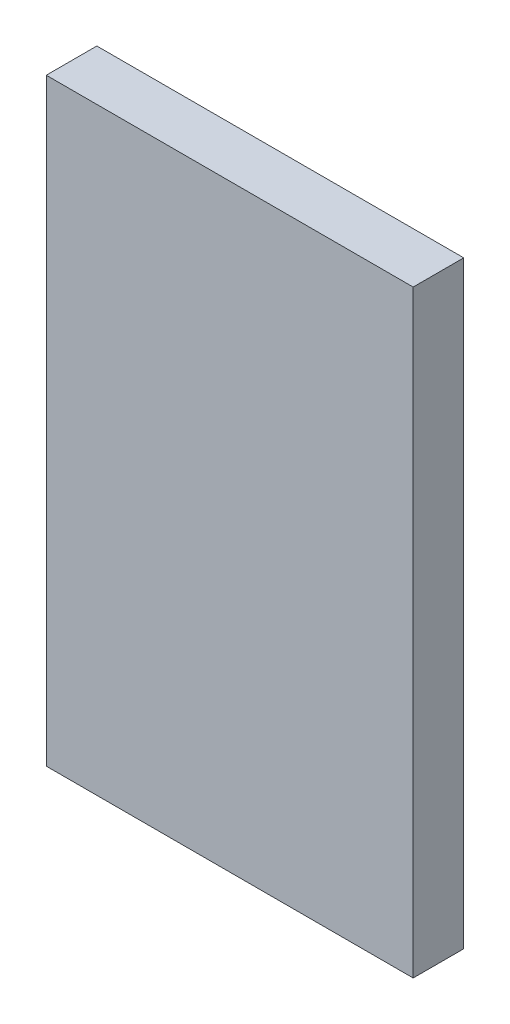
ISO-10303-21;
HEADER;
FILE_DESCRIPTION(('STEP AP214'),'2;1');
FILE_NAME('part.step','',(''),(''),'','','');
FILE_SCHEMA(('AUTOMOTIVE_DESIGN { 1 0 10303 214 1 1 1 1 }'));
ENDSEC;
DATA;
#1=APPLICATION_CONTEXT('core data for automotive mechanical design processes');
#2=APPLICATION_PROTOCOL_DEFINITION('international standard','automotive_design',2000,#1);
#3=PRODUCT_CONTEXT('',#1,'mechanical');
#4=PRODUCT('Part','Part','',(#3));
#5=PRODUCT_RELATED_PRODUCT_CATEGORY('part','',(#4));
#6=PRODUCT_DEFINITION_FORMATION('','',#4);
#7=PRODUCT_DEFINITION_CONTEXT('part definition',#1,'design');
#8=PRODUCT_DEFINITION('design','',#6,#7);
#9=PRODUCT_DEFINITION_SHAPE('','',#8);
#10=(LENGTH_UNIT() NAMED_UNIT(*) SI_UNIT(.MILLI.,.METRE.));
#11=(NAMED_UNIT(*) PLANE_ANGLE_UNIT() SI_UNIT($,.RADIAN.));
#12=(NAMED_UNIT(*) SI_UNIT($,.STERADIAN.) SOLID_ANGLE_UNIT());
#13=UNCERTAINTY_MEASURE_WITH_UNIT(LENGTH_MEASURE(1.E-05),#10,'distance_accuracy_value','');
#14=(GEOMETRIC_REPRESENTATION_CONTEXT(3) GLOBAL_UNCERTAINTY_ASSIGNED_CONTEXT((#13)) GLOBAL_UNIT_ASSIGNED_CONTEXT((#10,
#11,#12)) REPRESENTATION_CONTEXT('',''));
#15=CARTESIAN_POINT('',(0.,0.,0.));
#16=DIRECTION('',(0.,0.,1.));
#17=DIRECTION('',(1.,0.,0.));
#18=AXIS2_PLACEMENT_3D('',#15,#16,#17);
#19=CARTESIAN_POINT('',(-609.306060572635,400.501470811378,103.));
#20=DIRECTION('',(1.,0.,0.));
#21=DIRECTION('',(0.,1.,0.));
#22=AXIS2_PLACEMENT_3D('',#19,#20,#21);
#23=PLANE('',#22);
#24=DIRECTION('',(0.,-1.,0.));
#25=VECTOR('',#24,1.);
#26=CARTESIAN_POINT('',(-609.306060572635,400.501470811378,0.));
#27=LINE('',#26,#25);
#28=CARTESIAN_POINT('',(-609.306060572635,400.501470811378,0.));
#29=VERTEX_POINT('',#28);
#30=CARTESIAN_POINT('',(-609.306060572635,-818.118071672355,0.));
#31=VERTEX_POINT('',#30);
#32=EDGE_CURVE('E96',#29,#31,#27,.T.);
#33=ORIENTED_EDGE('',*,*,#32,.T.);
#34=DIRECTION('',(0.,0.,-1.));
#35=VECTOR('',#34,1.);
#36=CARTESIAN_POINT('',(-609.306060572635,-818.118071672355,103.));
#37=LINE('',#36,#35);
#38=CARTESIAN_POINT('',(-609.306060572635,-818.118071672355,103.));
#39=VERTEX_POINT('',#38);
#40=EDGE_CURVE('E11',#39,#31,#37,.T.);
#41=ORIENTED_EDGE('',*,*,#40,.F.);
#42=DIRECTION('',(0.,-1.,0.));
#43=VECTOR('',#42,1.);
#44=CARTESIAN_POINT('',(-609.306060572635,400.501470811378,103.));
#45=LINE('',#44,#43);
#46=CARTESIAN_POINT('',(-609.306060572635,400.501470811378,103.));
#47=VERTEX_POINT('',#46);
#48=EDGE_CURVE('E84',#47,#39,#45,.T.);
#49=ORIENTED_EDGE('',*,*,#48,.F.);
#50=DIRECTION('',(0.,0.,-1.));
#51=VECTOR('',#50,1.);
#52=CARTESIAN_POINT('',(-609.306060572635,400.501470811378,103.));
#53=LINE('',#52,#51);
#54=EDGE_CURVE('E92',#47,#29,#53,.T.);
#55=ORIENTED_EDGE('',*,*,#54,.T.);
#56=EDGE_LOOP('',(#33,#41,#49,#55));
#57=FACE_BOUND('',#56,.T.);
#58=ADVANCED_FACE('F33',(#57),#23,.F.);
#59=CARTESIAN_POINT('',(-609.306060572635,-818.118071672355,103.));
#60=DIRECTION('',(0.,1.,0.));
#61=DIRECTION('',(0.,0.,1.));
#62=AXIS2_PLACEMENT_3D('',#59,#60,#61);
#63=PLANE('',#62);
#64=DIRECTION('',(1.,0.,0.));
#65=VECTOR('',#64,1.);
#66=CARTESIAN_POINT('',(-609.306060572635,-818.118071672355,0.));
#67=LINE('',#66,#65);
#68=CARTESIAN_POINT('',(137.916258592071,-818.118071672355,0.));
#69=VERTEX_POINT('',#68);
#70=EDGE_CURVE('E88',#31,#69,#67,.T.);
#71=ORIENTED_EDGE('',*,*,#70,.T.);
#72=DIRECTION('',(0.,0.,-1.));
#73=VECTOR('',#72,1.);
#74=CARTESIAN_POINT('',(137.916258592071,-818.118071672355,103.));
#75=LINE('',#74,#73);
#76=CARTESIAN_POINT('',(137.916258592071,-818.118071672355,103.));
#77=VERTEX_POINT('',#76);
#78=EDGE_CURVE('E41',#77,#69,#75,.T.);
#79=ORIENTED_EDGE('',*,*,#78,.F.);
#80=DIRECTION('',(1.,0.,0.));
#81=VECTOR('',#80,1.);
#82=CARTESIAN_POINT('',(-609.306060572635,-818.118071672355,103.));
#83=LINE('',#82,#81);
#84=EDGE_CURVE('E79',#39,#77,#83,.T.);
#85=ORIENTED_EDGE('',*,*,#84,.F.);
#86=ORIENTED_EDGE('',*,*,#40,.T.);
#87=EDGE_LOOP('',(#71,#79,#85,#86));
#88=FACE_BOUND('',#87,.T.);
#89=ADVANCED_FACE('F87',(#88),#63,.F.);
#90=CARTESIAN_POINT('',(137.916258592071,400.501470811378,103.));
#91=DIRECTION('',(-1.,0.,0.));
#92=DIRECTION('',(0.,-1.,0.));
#93=AXIS2_PLACEMENT_3D('',#90,#91,#92);
#94=PLANE('',#93);
#95=DIRECTION('',(0.,1.,0.));
#96=VECTOR('',#95,1.);
#97=CARTESIAN_POINT('',(137.916258592071,400.501470811378,0.));
#98=LINE('',#97,#96);
#99=CARTESIAN_POINT('',(137.916258592071,400.501470811378,0.));
#100=VERTEX_POINT('',#99);
#101=EDGE_CURVE('E66',#69,#100,#98,.T.);
#102=ORIENTED_EDGE('',*,*,#101,.T.);
#103=DIRECTION('',(0.,0.,-1.));
#104=VECTOR('',#103,1.);
#105=CARTESIAN_POINT('',(137.916258592071,400.501470811378,103.));
#106=LINE('',#105,#104);
#107=CARTESIAN_POINT('',(137.916258592071,400.501470811378,103.));
#108=VERTEX_POINT('',#107);
#109=EDGE_CURVE('E89',#108,#100,#106,.T.);
#110=ORIENTED_EDGE('',*,*,#109,.F.);
#111=DIRECTION('',(0.,1.,0.));
#112=VECTOR('',#111,1.);
#113=CARTESIAN_POINT('',(137.916258592071,400.501470811378,103.));
#114=LINE('',#113,#112);
#115=EDGE_CURVE('E82',#77,#108,#114,.T.);
#116=ORIENTED_EDGE('',*,*,#115,.F.);
#117=ORIENTED_EDGE('',*,*,#78,.T.);
#118=EDGE_LOOP('',(#102,#110,#116,#117));
#119=FACE_BOUND('',#118,.T.);
#120=ADVANCED_FACE('F90',(#119),#94,.F.);
#121=CARTESIAN_POINT('',(-609.306060572635,400.501470811378,103.));
#122=DIRECTION('',(0.,-1.,0.));
#123=DIRECTION('',(0.,0.,-1.));
#124=AXIS2_PLACEMENT_3D('',#121,#122,#123);
#125=PLANE('',#124);
#126=DIRECTION('',(-1.,0.,0.));
#127=VECTOR('',#126,1.);
#128=CARTESIAN_POINT('',(-609.306060572635,400.501470811378,0.));
#129=LINE('',#128,#127);
#130=EDGE_CURVE('E72',#100,#29,#129,.T.);
#131=ORIENTED_EDGE('',*,*,#130,.T.);
#132=ORIENTED_EDGE('',*,*,#54,.F.);
#133=DIRECTION('',(-1.,0.,0.));
#134=VECTOR('',#133,1.);
#135=CARTESIAN_POINT('',(-609.306060572635,400.501470811378,103.));
#136=LINE('',#135,#134);
#137=EDGE_CURVE('E49',#108,#47,#136,.T.);
#138=ORIENTED_EDGE('',*,*,#137,.F.);
#139=ORIENTED_EDGE('',*,*,#109,.T.);
#140=EDGE_LOOP('',(#131,#132,#138,#139));
#141=FACE_BOUND('',#140,.T.);
#142=ADVANCED_FACE('F103',(#141),#125,.F.);
#143=CARTESIAN_POINT('',(0.,0.,103.));
#144=DIRECTION('',(0.,0.,1.));
#145=DIRECTION('',(1.,0.,0.));
#146=AXIS2_PLACEMENT_3D('',#143,#144,#145);
#147=PLANE('',#146);
#148=ORIENTED_EDGE('',*,*,#48,.T.);
#149=ORIENTED_EDGE('',*,*,#84,.T.);
#150=ORIENTED_EDGE('',*,*,#115,.T.);
#151=ORIENTED_EDGE('',*,*,#137,.T.);
#152=EDGE_LOOP('',(#148,#149,#150,#151));
#153=FACE_BOUND('',#152,.T.);
#154=ADVANCED_FACE('F80',(#153),#147,.T.);
#155=CARTESIAN_POINT('',(0.,0.,0.));
#156=DIRECTION('',(0.,0.,1.));
#157=DIRECTION('',(1.,0.,0.));
#158=AXIS2_PLACEMENT_3D('',#155,#156,#157);
#159=PLANE('',#158);
#160=ORIENTED_EDGE('',*,*,#32,.F.);
#161=ORIENTED_EDGE('',*,*,#130,.F.);
#162=ORIENTED_EDGE('',*,*,#101,.F.);
#163=ORIENTED_EDGE('',*,*,#70,.F.);
#164=EDGE_LOOP('',(#160,#161,#162,#163));
#165=FACE_BOUND('',#164,.T.);
#166=ADVANCED_FACE('F106',(#165),#159,.F.);
#167=CLOSED_SHELL('',(#58,#89,#120,#142,#154,#166));
#168=MANIFOLD_SOLID_BREP('B2',#167);
#169=ADVANCED_BREP_SHAPE_REPRESENTATION('',(#18,#168),#14);
#170=SHAPE_DEFINITION_REPRESENTATION(#9,#169);
ENDSEC;
END-ISO-10303-21;
